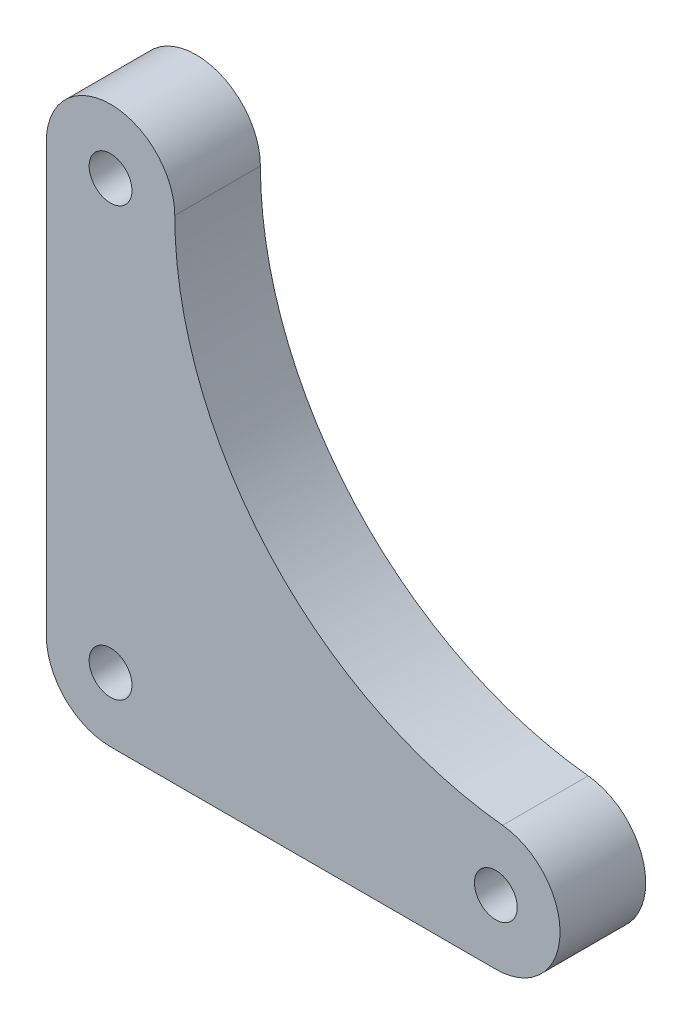
ISO-10303-21;
HEADER;
FILE_DESCRIPTION(('STEP AP214'),'2;1');
FILE_NAME('part.step','',(''),(''),'','','');
FILE_SCHEMA(('AUTOMOTIVE_DESIGN { 1 0 10303 214 1 1 1 1 }'));
ENDSEC;
DATA;
#1=APPLICATION_CONTEXT('core data for automotive mechanical design processes');
#2=APPLICATION_PROTOCOL_DEFINITION('international standard','automotive_design',2000,#1);
#3=PRODUCT_CONTEXT('',#1,'mechanical');
#4=PRODUCT('Part','Part','',(#3));
#5=PRODUCT_RELATED_PRODUCT_CATEGORY('part','',(#4));
#6=PRODUCT_DEFINITION_FORMATION('','',#4);
#7=PRODUCT_DEFINITION_CONTEXT('part definition',#1,'design');
#8=PRODUCT_DEFINITION('design','',#6,#7);
#9=PRODUCT_DEFINITION_SHAPE('','',#8);
#10=(LENGTH_UNIT() NAMED_UNIT(*) SI_UNIT(.MILLI.,.METRE.));
#11=(NAMED_UNIT(*) PLANE_ANGLE_UNIT() SI_UNIT($,.RADIAN.));
#12=(NAMED_UNIT(*) SI_UNIT($,.STERADIAN.) SOLID_ANGLE_UNIT());
#13=UNCERTAINTY_MEASURE_WITH_UNIT(LENGTH_MEASURE(1.E-05),#10,'distance_accuracy_value','');
#14=(GEOMETRIC_REPRESENTATION_CONTEXT(3) GLOBAL_UNCERTAINTY_ASSIGNED_CONTEXT((#13)) GLOBAL_UNIT_ASSIGNED_CONTEXT((#10,
#11,#12)) REPRESENTATION_CONTEXT('',''));
#15=CARTESIAN_POINT('',(0.,0.,0.));
#16=DIRECTION('',(0.,0.,1.));
#17=DIRECTION('',(1.,0.,0.));
#18=AXIS2_PLACEMENT_3D('',#15,#16,#17);
#19=CARTESIAN_POINT('',(0.,50.,10.));
#20=DIRECTION('',(0.,0.,-1.));
#21=DIRECTION('',(-1.,0.,0.));
#22=AXIS2_PLACEMENT_3D('',#19,#20,#21);
#23=PLANE('',#22);
#24=CARTESIAN_POINT('',(0.,50.,10.));
#25=DIRECTION('',(0.,0.,1.));
#26=DIRECTION('',(-1.,0.,0.));
#27=AXIS2_PLACEMENT_3D('',#24,#25,#26);
#28=CIRCLE('',#27,7.5);
#29=CARTESIAN_POINT('',(7.5,50.,10.));
#30=VERTEX_POINT('',#29);
#31=CARTESIAN_POINT('',(-7.5,50.,10.));
#32=VERTEX_POINT('',#31);
#33=EDGE_CURVE('E130',#30,#32,#28,.T.);
#34=ORIENTED_EDGE('',*,*,#33,.T.);
#35=DIRECTION('',(0.,-1.,0.));
#36=VECTOR('',#35,1.);
#37=CARTESIAN_POINT('',(-7.5,0.,10.));
#38=LINE('',#37,#36);
#39=CARTESIAN_POINT('',(-7.5,0.,10.));
#40=VERTEX_POINT('',#39);
#41=EDGE_CURVE('E88',#32,#40,#38,.T.);
#42=ORIENTED_EDGE('',*,*,#41,.T.);
#43=CARTESIAN_POINT('',(0.,0.,10.));
#44=DIRECTION('',(0.,0.,1.));
#45=DIRECTION('',(1.,0.,0.));
#46=AXIS2_PLACEMENT_3D('',#43,#44,#45);
#47=CIRCLE('',#46,7.5);
#48=CARTESIAN_POINT('',(0.,-7.5,10.));
#49=VERTEX_POINT('',#48);
#50=EDGE_CURVE('E101',#40,#49,#47,.T.);
#51=ORIENTED_EDGE('',*,*,#50,.T.);
#52=DIRECTION('',(1.,0.,0.));
#53=VECTOR('',#52,1.);
#54=CARTESIAN_POINT('',(0.,-7.5,10.));
#55=LINE('',#54,#53);
#56=CARTESIAN_POINT('',(45.,-7.5,10.));
#57=VERTEX_POINT('',#56);
#58=EDGE_CURVE('E95',#49,#57,#55,.T.);
#59=ORIENTED_EDGE('',*,*,#58,.T.);
#60=CARTESIAN_POINT('',(45.,0.,10.));
#61=DIRECTION('',(0.,0.,1.));
#62=DIRECTION('',(-1.,0.,0.));
#63=AXIS2_PLACEMENT_3D('',#60,#61,#62);
#64=CIRCLE('',#63,7.5);
#65=CARTESIAN_POINT('',(45.7872928176796,7.4585635359116,10.));
#66=VERTEX_POINT('',#65);
#67=EDGE_CURVE('E99',#57,#66,#64,.T.);
#68=ORIENTED_EDGE('',*,*,#67,.T.);
#69=CARTESIAN_POINT('',(50.2777777777778,50.,10.));
#70=DIRECTION('',(0.,0.,-1.));
#71=DIRECTION('',(1.,0.,0.));
#72=AXIS2_PLACEMENT_3D('',#69,#70,#71);
#73=CIRCLE('',#72,42.7777777777778);
#74=EDGE_CURVE('E51',#66,#30,#73,.T.);
#75=ORIENTED_EDGE('',*,*,#74,.T.);
#76=EDGE_LOOP('',(#34,#42,#51,#59,#68,#75));
#77=FACE_BOUND('',#76,.T.);
#78=CARTESIAN_POINT('',(0.,0.,10.));
#79=DIRECTION('',(0.,0.,1.));
#80=DIRECTION('',(1.,0.,0.));
#81=AXIS2_PLACEMENT_3D('',#78,#79,#80);
#82=CIRCLE('',#81,2.5);
#83=CARTESIAN_POINT('',(2.5,0.,10.));
#84=VERTEX_POINT('',#83);
#85=EDGE_CURVE('E123',#84,#84,#82,.T.);
#86=ORIENTED_EDGE('',*,*,#85,.F.);
#87=EDGE_LOOP('',(#86));
#88=FACE_BOUND('',#87,.T.);
#89=CARTESIAN_POINT('',(45.,0.,10.));
#90=DIRECTION('',(0.,0.,1.));
#91=DIRECTION('',(1.,0.,0.));
#92=AXIS2_PLACEMENT_3D('',#89,#90,#91);
#93=CIRCLE('',#92,2.5);
#94=CARTESIAN_POINT('',(47.5,0.,10.));
#95=VERTEX_POINT('',#94);
#96=EDGE_CURVE('E184',#95,#95,#93,.T.);
#97=ORIENTED_EDGE('',*,*,#96,.F.);
#98=EDGE_LOOP('',(#97));
#99=FACE_BOUND('',#98,.T.);
#100=CARTESIAN_POINT('',(0.,50.,10.));
#101=DIRECTION('',(0.,0.,1.));
#102=DIRECTION('',(1.,0.,0.));
#103=AXIS2_PLACEMENT_3D('',#100,#101,#102);
#104=CIRCLE('',#103,2.5);
#105=CARTESIAN_POINT('',(2.5,50.,10.));
#106=VERTEX_POINT('',#105);
#107=EDGE_CURVE('E175',#106,#106,#104,.T.);
#108=ORIENTED_EDGE('',*,*,#107,.F.);
#109=EDGE_LOOP('',(#108));
#110=FACE_BOUND('',#109,.T.);
#111=ADVANCED_FACE('F34',(#77,#88,#99,#110),#23,.F.);
#112=CARTESIAN_POINT('',(0.,50.,0.));
#113=DIRECTION('',(0.,0.,-1.));
#114=DIRECTION('',(-1.,0.,0.));
#115=AXIS2_PLACEMENT_3D('',#112,#113,#114);
#116=PLANE('',#115);
#117=CARTESIAN_POINT('',(45.,0.,0.));
#118=DIRECTION('',(0.,0.,1.));
#119=DIRECTION('',(1.,0.,0.));
#120=AXIS2_PLACEMENT_3D('',#117,#118,#119);
#121=CIRCLE('',#120,2.5);
#122=CARTESIAN_POINT('',(47.5,0.,0.));
#123=VERTEX_POINT('',#122);
#124=EDGE_CURVE('E181',#123,#123,#121,.T.);
#125=ORIENTED_EDGE('',*,*,#124,.T.);
#126=EDGE_LOOP('',(#125));
#127=FACE_BOUND('',#126,.T.);
#128=CARTESIAN_POINT('',(0.,50.,0.));
#129=DIRECTION('',(0.,0.,1.));
#130=DIRECTION('',(-1.,0.,0.));
#131=AXIS2_PLACEMENT_3D('',#128,#129,#130);
#132=CIRCLE('',#131,7.5);
#133=CARTESIAN_POINT('',(7.5,50.,0.));
#134=VERTEX_POINT('',#133);
#135=CARTESIAN_POINT('',(-7.5,50.,0.));
#136=VERTEX_POINT('',#135);
#137=EDGE_CURVE('E119',#134,#136,#132,.T.);
#138=ORIENTED_EDGE('',*,*,#137,.F.);
#139=CARTESIAN_POINT('',(50.2777777777778,50.,0.));
#140=DIRECTION('',(0.,0.,-1.));
#141=DIRECTION('',(1.,0.,0.));
#142=AXIS2_PLACEMENT_3D('',#139,#140,#141);
#143=CIRCLE('',#142,42.7777777777778);
#144=CARTESIAN_POINT('',(45.7872928176796,7.4585635359116,0.));
#145=VERTEX_POINT('',#144);
#146=EDGE_CURVE('E80',#145,#134,#143,.T.);
#147=ORIENTED_EDGE('',*,*,#146,.F.);
#148=CARTESIAN_POINT('',(45.,0.,0.));
#149=DIRECTION('',(0.,0.,1.));
#150=DIRECTION('',(-1.,0.,0.));
#151=AXIS2_PLACEMENT_3D('',#148,#149,#150);
#152=CIRCLE('',#151,7.5);
#153=CARTESIAN_POINT('',(45.,-7.5,0.));
#154=VERTEX_POINT('',#153);
#155=EDGE_CURVE('E74',#154,#145,#152,.T.);
#156=ORIENTED_EDGE('',*,*,#155,.F.);
#157=DIRECTION('',(1.,0.,0.));
#158=VECTOR('',#157,1.);
#159=CARTESIAN_POINT('',(0.,-7.5,0.));
#160=LINE('',#159,#158);
#161=CARTESIAN_POINT('',(0.,-7.5,0.));
#162=VERTEX_POINT('',#161);
#163=EDGE_CURVE('E109',#162,#154,#160,.T.);
#164=ORIENTED_EDGE('',*,*,#163,.F.);
#165=CARTESIAN_POINT('',(0.,0.,0.));
#166=DIRECTION('',(0.,0.,1.));
#167=DIRECTION('',(1.,0.,0.));
#168=AXIS2_PLACEMENT_3D('',#165,#166,#167);
#169=CIRCLE('',#168,7.5);
#170=CARTESIAN_POINT('',(-7.5,0.,0.));
#171=VERTEX_POINT('',#170);
#172=EDGE_CURVE('E125',#171,#162,#169,.T.);
#173=ORIENTED_EDGE('',*,*,#172,.F.);
#174=DIRECTION('',(0.,-1.,0.));
#175=VECTOR('',#174,1.);
#176=CARTESIAN_POINT('',(-7.5,0.,0.));
#177=LINE('',#176,#175);
#178=EDGE_CURVE('E122',#136,#171,#177,.T.);
#179=ORIENTED_EDGE('',*,*,#178,.F.);
#180=EDGE_LOOP('',(#138,#147,#156,#164,#173,#179));
#181=FACE_BOUND('',#180,.T.);
#182=CARTESIAN_POINT('',(0.,0.,0.));
#183=DIRECTION('',(0.,0.,1.));
#184=DIRECTION('',(1.,0.,0.));
#185=AXIS2_PLACEMENT_3D('',#182,#183,#184);
#186=CIRCLE('',#185,2.5);
#187=CARTESIAN_POINT('',(2.5,0.,0.));
#188=VERTEX_POINT('',#187);
#189=EDGE_CURVE('E187',#188,#188,#186,.T.);
#190=ORIENTED_EDGE('',*,*,#189,.T.);
#191=EDGE_LOOP('',(#190));
#192=FACE_BOUND('',#191,.T.);
#193=CARTESIAN_POINT('',(0.,50.,0.));
#194=DIRECTION('',(0.,0.,1.));
#195=DIRECTION('',(1.,0.,0.));
#196=AXIS2_PLACEMENT_3D('',#193,#194,#195);
#197=CIRCLE('',#196,2.5);
#198=CARTESIAN_POINT('',(2.5,50.,0.));
#199=VERTEX_POINT('',#198);
#200=EDGE_CURVE('E178',#199,#199,#197,.T.);
#201=ORIENTED_EDGE('',*,*,#200,.T.);
#202=EDGE_LOOP('',(#201));
#203=FACE_BOUND('',#202,.T.);
#204=ADVANCED_FACE('F139',(#127,#181,#192,#203),#116,.T.);
#205=CARTESIAN_POINT('',(0.,50.,10.));
#206=DIRECTION('',(0.,0.,-1.));
#207=DIRECTION('',(-1.,0.,0.));
#208=AXIS2_PLACEMENT_3D('',#205,#206,#207);
#209=CYLINDRICAL_SURFACE('',#208,7.5);
#210=ORIENTED_EDGE('',*,*,#137,.T.);
#211=DIRECTION('',(0.,0.,-1.));
#212=VECTOR('',#211,1.);
#213=CARTESIAN_POINT('',(-7.5,50.,10.));
#214=LINE('',#213,#212);
#215=EDGE_CURVE('E11',#32,#136,#214,.T.);
#216=ORIENTED_EDGE('',*,*,#215,.F.);
#217=ORIENTED_EDGE('',*,*,#33,.F.);
#218=DIRECTION('',(0.,0.,-1.));
#219=VECTOR('',#218,1.);
#220=CARTESIAN_POINT('',(7.5,50.,10.));
#221=LINE('',#220,#219);
#222=EDGE_CURVE('E115',#30,#134,#221,.T.);
#223=ORIENTED_EDGE('',*,*,#222,.T.);
#224=EDGE_LOOP('',(#210,#216,#217,#223));
#225=FACE_BOUND('',#224,.T.);
#226=ADVANCED_FACE('F36',(#225),#209,.T.);
#227=CARTESIAN_POINT('',(-7.5,0.,10.));
#228=DIRECTION('',(1.,0.,0.));
#229=DIRECTION('',(0.,1.,0.));
#230=AXIS2_PLACEMENT_3D('',#227,#228,#229);
#231=PLANE('',#230);
#232=ORIENTED_EDGE('',*,*,#178,.T.);
#233=DIRECTION('',(0.,0.,-1.));
#234=VECTOR('',#233,1.);
#235=CARTESIAN_POINT('',(-7.5,0.,10.));
#236=LINE('',#235,#234);
#237=EDGE_CURVE('E43',#40,#171,#236,.T.);
#238=ORIENTED_EDGE('',*,*,#237,.F.);
#239=ORIENTED_EDGE('',*,*,#41,.F.);
#240=ORIENTED_EDGE('',*,*,#215,.T.);
#241=EDGE_LOOP('',(#232,#238,#239,#240));
#242=FACE_BOUND('',#241,.T.);
#243=ADVANCED_FACE('F238',(#242),#231,.F.);
#244=CARTESIAN_POINT('',(0.,0.,10.));
#245=DIRECTION('',(0.,0.,-1.));
#246=DIRECTION('',(-1.,0.,0.));
#247=AXIS2_PLACEMENT_3D('',#244,#245,#246);
#248=CYLINDRICAL_SURFACE('',#247,7.5);
#249=ORIENTED_EDGE('',*,*,#172,.T.);
#250=DIRECTION('',(0.,0.,-1.));
#251=VECTOR('',#250,1.);
#252=CARTESIAN_POINT('',(0.,-7.5,10.));
#253=LINE('',#252,#251);
#254=EDGE_CURVE('E110',#49,#162,#253,.T.);
#255=ORIENTED_EDGE('',*,*,#254,.F.);
#256=ORIENTED_EDGE('',*,*,#50,.F.);
#257=ORIENTED_EDGE('',*,*,#237,.T.);
#258=EDGE_LOOP('',(#249,#255,#256,#257));
#259=FACE_BOUND('',#258,.T.);
#260=ADVANCED_FACE('F136',(#259),#248,.T.);
#261=CARTESIAN_POINT('',(0.,-7.5,10.));
#262=DIRECTION('',(0.,1.,0.));
#263=DIRECTION('',(-1.,0.,0.));
#264=AXIS2_PLACEMENT_3D('',#261,#262,#263);
#265=PLANE('',#264);
#266=ORIENTED_EDGE('',*,*,#163,.T.);
#267=DIRECTION('',(0.,0.,-1.));
#268=VECTOR('',#267,1.);
#269=CARTESIAN_POINT('',(45.,-7.5,10.));
#270=LINE('',#269,#268);
#271=EDGE_CURVE('E106',#57,#154,#270,.T.);
#272=ORIENTED_EDGE('',*,*,#271,.F.);
#273=ORIENTED_EDGE('',*,*,#58,.F.);
#274=ORIENTED_EDGE('',*,*,#254,.T.);
#275=EDGE_LOOP('',(#266,#272,#273,#274));
#276=FACE_BOUND('',#275,.T.);
#277=ADVANCED_FACE('F107',(#276),#265,.F.);
#278=CARTESIAN_POINT('',(45.,0.,10.));
#279=DIRECTION('',(0.,0.,-1.));
#280=DIRECTION('',(-1.,0.,0.));
#281=AXIS2_PLACEMENT_3D('',#278,#279,#280);
#282=CYLINDRICAL_SURFACE('',#281,7.5);
#283=ORIENTED_EDGE('',*,*,#155,.T.);
#284=DIRECTION('',(0.,0.,-1.));
#285=VECTOR('',#284,1.);
#286=CARTESIAN_POINT('',(45.7872928176796,7.4585635359116,10.));
#287=LINE('',#286,#285);
#288=EDGE_CURVE('E111',#66,#145,#287,.T.);
#289=ORIENTED_EDGE('',*,*,#288,.F.);
#290=ORIENTED_EDGE('',*,*,#67,.F.);
#291=ORIENTED_EDGE('',*,*,#271,.T.);
#292=EDGE_LOOP('',(#283,#289,#290,#291));
#293=FACE_BOUND('',#292,.T.);
#294=ADVANCED_FACE('F113',(#293),#282,.T.);
#295=CARTESIAN_POINT('',(50.2777777777778,50.,10.));
#296=DIRECTION('',(0.,0.,-1.));
#297=DIRECTION('',(-1.,0.,0.));
#298=AXIS2_PLACEMENT_3D('',#295,#296,#297);
#299=CYLINDRICAL_SURFACE('',#298,42.7777777777778);
#300=ORIENTED_EDGE('',*,*,#146,.T.);
#301=ORIENTED_EDGE('',*,*,#222,.F.);
#302=ORIENTED_EDGE('',*,*,#74,.F.);
#303=ORIENTED_EDGE('',*,*,#288,.T.);
#304=EDGE_LOOP('',(#300,#301,#302,#303));
#305=FACE_BOUND('',#304,.T.);
#306=ADVANCED_FACE('F144',(#305),#299,.F.);
#307=CARTESIAN_POINT('',(0.,0.,10.));
#308=DIRECTION('',(0.,0.,-1.));
#309=DIRECTION('',(-1.,0.,0.));
#310=AXIS2_PLACEMENT_3D('',#307,#308,#309);
#311=CYLINDRICAL_SURFACE('',#310,2.5);
#312=ORIENTED_EDGE('',*,*,#85,.T.);
#313=EDGE_LOOP('',(#312));
#314=FACE_BOUND('',#313,.T.);
#315=ORIENTED_EDGE('',*,*,#189,.F.);
#316=EDGE_LOOP('',(#315));
#317=FACE_BOUND('',#316,.T.);
#318=ADVANCED_FACE('F146',(#314,#317),#311,.F.);
#319=CARTESIAN_POINT('',(45.,0.,10.));
#320=DIRECTION('',(0.,0.,-1.));
#321=DIRECTION('',(-1.,0.,0.));
#322=AXIS2_PLACEMENT_3D('',#319,#320,#321);
#323=CYLINDRICAL_SURFACE('',#322,2.5);
#324=ORIENTED_EDGE('',*,*,#96,.T.);
#325=EDGE_LOOP('',(#324));
#326=FACE_BOUND('',#325,.T.);
#327=ORIENTED_EDGE('',*,*,#124,.F.);
#328=EDGE_LOOP('',(#327));
#329=FACE_BOUND('',#328,.T.);
#330=ADVANCED_FACE('F152',(#326,#329),#323,.F.);
#331=CARTESIAN_POINT('',(0.,50.,10.));
#332=DIRECTION('',(0.,0.,-1.));
#333=DIRECTION('',(-1.,0.,0.));
#334=AXIS2_PLACEMENT_3D('',#331,#332,#333);
#335=CYLINDRICAL_SURFACE('',#334,2.5);
#336=ORIENTED_EDGE('',*,*,#107,.T.);
#337=EDGE_LOOP('',(#336));
#338=FACE_BOUND('',#337,.T.);
#339=ORIENTED_EDGE('',*,*,#200,.F.);
#340=EDGE_LOOP('',(#339));
#341=FACE_BOUND('',#340,.T.);
#342=ADVANCED_FACE('F166',(#338,#341),#335,.F.);
#343=CLOSED_SHELL('',(#111,#204,#226,#243,#260,#277,#294,#306,#318,#330,#342));
#344=MANIFOLD_SOLID_BREP('B2',#343);
#345=ADVANCED_BREP_SHAPE_REPRESENTATION('',(#18,#344),#14);
#346=SHAPE_DEFINITION_REPRESENTATION(#9,#345);
ENDSEC;
END-ISO-10303-21;
